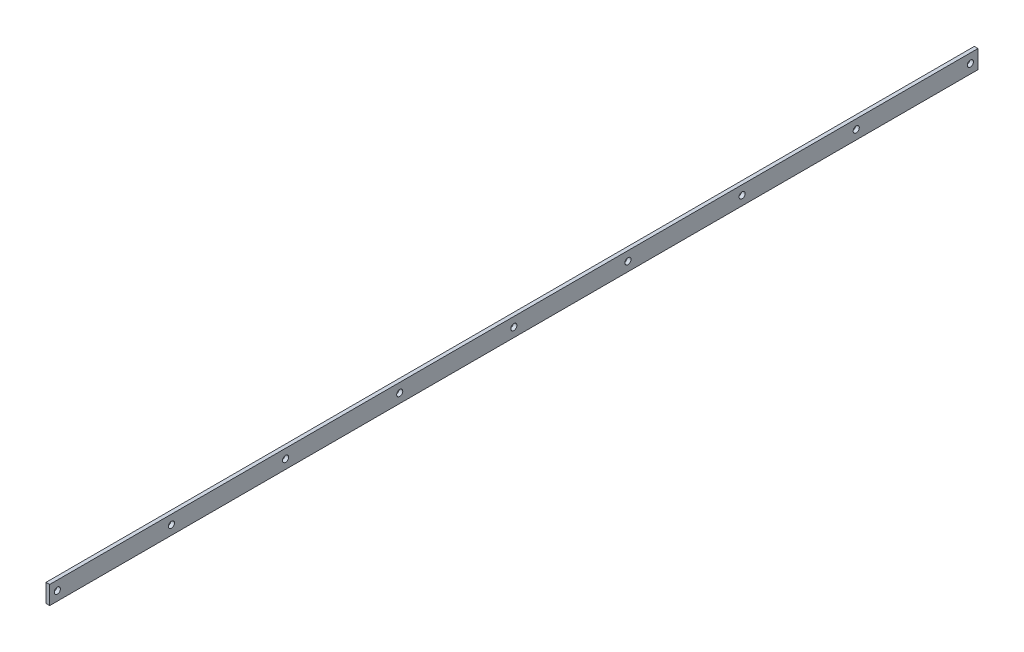
ISO-10303-21;
HEADER;
FILE_DESCRIPTION(('STEP AP214'),'2;1');
FILE_NAME('part.step','',(''),(''),'','','');
FILE_SCHEMA(('AUTOMOTIVE_DESIGN { 1 0 10303 214 1 1 1 1 }'));
ENDSEC;
DATA;
#1=APPLICATION_CONTEXT('core data for automotive mechanical design processes');
#2=APPLICATION_PROTOCOL_DEFINITION('international standard','automotive_design',2000,#1);
#3=PRODUCT_CONTEXT('',#1,'mechanical');
#4=PRODUCT('Part','Part','',(#3));
#5=PRODUCT_RELATED_PRODUCT_CATEGORY('part','',(#4));
#6=PRODUCT_DEFINITION_FORMATION('','',#4);
#7=PRODUCT_DEFINITION_CONTEXT('part definition',#1,'design');
#8=PRODUCT_DEFINITION('design','',#6,#7);
#9=PRODUCT_DEFINITION_SHAPE('','',#8);
#10=(LENGTH_UNIT() NAMED_UNIT(*) SI_UNIT(.MILLI.,.METRE.));
#11=(NAMED_UNIT(*) PLANE_ANGLE_UNIT() SI_UNIT($,.RADIAN.));
#12=(NAMED_UNIT(*) SI_UNIT($,.STERADIAN.) SOLID_ANGLE_UNIT());
#13=UNCERTAINTY_MEASURE_WITH_UNIT(LENGTH_MEASURE(1.E-05),#10,'distance_accuracy_value','');
#14=(GEOMETRIC_REPRESENTATION_CONTEXT(3) GLOBAL_UNCERTAINTY_ASSIGNED_CONTEXT((#13)) GLOBAL_UNIT_ASSIGNED_CONTEXT((#10,
#11,#12)) REPRESENTATION_CONTEXT('',''));
#15=CARTESIAN_POINT('',(0.,0.,0.));
#16=DIRECTION('',(0.,0.,1.));
#17=DIRECTION('',(1.,0.,0.));
#18=AXIS2_PLACEMENT_3D('',#15,#16,#17);
#19=CARTESIAN_POINT('',(0.,0.,-1492.));
#20=DIRECTION('',(1.,0.,0.));
#21=DIRECTION('',(0.,0.,-1.));
#22=AXIS2_PLACEMENT_3D('',#19,#20,#21);
#23=CYLINDRICAL_SURFACE('',#22,10.0000000000001);
#24=CARTESIAN_POINT('',(0.,0.,-1492.));
#25=DIRECTION('',(1.,0.,0.));
#26=DIRECTION('',(0.,0.,-1.));
#27=AXIS2_PLACEMENT_3D('',#24,#25,#26);
#28=CIRCLE('',#27,10.0000000000001);
#29=CARTESIAN_POINT('',(0.,0.,-1502.));
#30=VERTEX_POINT('',#29);
#31=EDGE_CURVE('E41',#30,#30,#28,.T.);
#32=ORIENTED_EDGE('',*,*,#31,.F.);
#33=EDGE_LOOP('',(#32));
#34=FACE_BOUND('',#33,.T.);
#35=CARTESIAN_POINT('',(12.,0.,-1492.));
#36=DIRECTION('',(1.,0.,0.));
#37=DIRECTION('',(0.,0.,-1.));
#38=AXIS2_PLACEMENT_3D('',#35,#36,#37);
#39=CIRCLE('',#38,10.0000000000001);
#40=CARTESIAN_POINT('',(12.,0.,-1502.));
#41=VERTEX_POINT('',#40);
#42=EDGE_CURVE('E11',#41,#41,#39,.T.);
#43=ORIENTED_EDGE('',*,*,#42,.T.);
#44=EDGE_LOOP('',(#43));
#45=FACE_BOUND('',#44,.T.);
#46=ADVANCED_FACE('F33',(#34,#45),#23,.F.);
#47=CARTESIAN_POINT('',(0.,0.,-1119.));
#48=DIRECTION('',(1.,0.,0.));
#49=DIRECTION('',(0.,0.,-1.));
#50=AXIS2_PLACEMENT_3D('',#47,#48,#49);
#51=CYLINDRICAL_SURFACE('',#50,10.0000000000001);
#52=CARTESIAN_POINT('',(0.,0.,-1119.));
#53=DIRECTION('',(1.,0.,0.));
#54=DIRECTION('',(0.,0.,-1.));
#55=AXIS2_PLACEMENT_3D('',#52,#53,#54);
#56=CIRCLE('',#55,10.0000000000001);
#57=CARTESIAN_POINT('',(0.,0.,-1129.));
#58=VERTEX_POINT('',#57);
#59=EDGE_CURVE('E141',#58,#58,#56,.T.);
#60=ORIENTED_EDGE('',*,*,#59,.F.);
#61=EDGE_LOOP('',(#60));
#62=FACE_BOUND('',#61,.T.);
#63=CARTESIAN_POINT('',(12.,0.,-1119.));
#64=DIRECTION('',(1.,0.,0.));
#65=DIRECTION('',(0.,0.,-1.));
#66=AXIS2_PLACEMENT_3D('',#63,#64,#65);
#67=CIRCLE('',#66,10.0000000000001);
#68=CARTESIAN_POINT('',(12.,0.,-1129.));
#69=VERTEX_POINT('',#68);
#70=EDGE_CURVE('E144',#69,#69,#67,.T.);
#71=ORIENTED_EDGE('',*,*,#70,.T.);
#72=EDGE_LOOP('',(#71));
#73=FACE_BOUND('',#72,.T.);
#74=ADVANCED_FACE('F153',(#62,#73),#51,.F.);
#75=CARTESIAN_POINT('',(0.,0.,-745.999999999997));
#76=DIRECTION('',(1.,0.,0.));
#77=DIRECTION('',(0.,0.,-1.));
#78=AXIS2_PLACEMENT_3D('',#75,#76,#77);
#79=CYLINDRICAL_SURFACE('',#78,10.0000000000001);
#80=CARTESIAN_POINT('',(0.,0.,-745.999999999997));
#81=DIRECTION('',(1.,0.,0.));
#82=DIRECTION('',(0.,0.,-1.));
#83=AXIS2_PLACEMENT_3D('',#80,#81,#82);
#84=CIRCLE('',#83,10.0000000000001);
#85=CARTESIAN_POINT('',(0.,0.,-755.999999999997));
#86=VERTEX_POINT('',#85);
#87=EDGE_CURVE('E135',#86,#86,#84,.T.);
#88=ORIENTED_EDGE('',*,*,#87,.F.);
#89=EDGE_LOOP('',(#88));
#90=FACE_BOUND('',#89,.T.);
#91=CARTESIAN_POINT('',(12.,0.,-745.999999999997));
#92=DIRECTION('',(1.,0.,0.));
#93=DIRECTION('',(0.,0.,-1.));
#94=AXIS2_PLACEMENT_3D('',#91,#92,#93);
#95=CIRCLE('',#94,10.0000000000001);
#96=CARTESIAN_POINT('',(12.,0.,-755.999999999997));
#97=VERTEX_POINT('',#96);
#98=EDGE_CURVE('E138',#97,#97,#95,.T.);
#99=ORIENTED_EDGE('',*,*,#98,.T.);
#100=EDGE_LOOP('',(#99));
#101=FACE_BOUND('',#100,.T.);
#102=ADVANCED_FACE('F196',(#90,#101),#79,.F.);
#103=CARTESIAN_POINT('',(0.,0.,-372.999999999997));
#104=DIRECTION('',(1.,0.,0.));
#105=DIRECTION('',(0.,0.,-1.));
#106=AXIS2_PLACEMENT_3D('',#103,#104,#105);
#107=CYLINDRICAL_SURFACE('',#106,10.0000000000001);
#108=CARTESIAN_POINT('',(0.,0.,-372.999999999997));
#109=DIRECTION('',(1.,0.,0.));
#110=DIRECTION('',(0.,0.,-1.));
#111=AXIS2_PLACEMENT_3D('',#108,#109,#110);
#112=CIRCLE('',#111,10.0000000000001);
#113=CARTESIAN_POINT('',(0.,0.,-382.999999999997));
#114=VERTEX_POINT('',#113);
#115=EDGE_CURVE('E129',#114,#114,#112,.T.);
#116=ORIENTED_EDGE('',*,*,#115,.F.);
#117=EDGE_LOOP('',(#116));
#118=FACE_BOUND('',#117,.T.);
#119=CARTESIAN_POINT('',(12.,0.,-372.999999999997));
#120=DIRECTION('',(1.,0.,0.));
#121=DIRECTION('',(0.,0.,-1.));
#122=AXIS2_PLACEMENT_3D('',#119,#120,#121);
#123=CIRCLE('',#122,10.0000000000001);
#124=CARTESIAN_POINT('',(12.,0.,-382.999999999997));
#125=VERTEX_POINT('',#124);
#126=EDGE_CURVE('E132',#125,#125,#123,.T.);
#127=ORIENTED_EDGE('',*,*,#126,.T.);
#128=EDGE_LOOP('',(#127));
#129=FACE_BOUND('',#128,.T.);
#130=ADVANCED_FACE('F192',(#118,#129),#107,.F.);
#131=CARTESIAN_POINT('',(0.,0.,3.10862446895044E-12));
#132=DIRECTION('',(1.,0.,0.));
#133=DIRECTION('',(0.,0.,-1.));
#134=AXIS2_PLACEMENT_3D('',#131,#132,#133);
#135=CYLINDRICAL_SURFACE('',#134,10.0000000000001);
#136=CARTESIAN_POINT('',(0.,0.,3.10862446895044E-12));
#137=DIRECTION('',(1.,0.,0.));
#138=DIRECTION('',(0.,0.,-1.));
#139=AXIS2_PLACEMENT_3D('',#136,#137,#138);
#140=CIRCLE('',#139,10.0000000000001);
#141=CARTESIAN_POINT('',(0.,0.,-9.99999999999698));
#142=VERTEX_POINT('',#141);
#143=EDGE_CURVE('E123',#142,#142,#140,.T.);
#144=ORIENTED_EDGE('',*,*,#143,.F.);
#145=EDGE_LOOP('',(#144));
#146=FACE_BOUND('',#145,.T.);
#147=CARTESIAN_POINT('',(12.,0.,3.10862446895044E-12));
#148=DIRECTION('',(1.,0.,0.));
#149=DIRECTION('',(0.,0.,-1.));
#150=AXIS2_PLACEMENT_3D('',#147,#148,#149);
#151=CIRCLE('',#150,10.0000000000001);
#152=CARTESIAN_POINT('',(12.,0.,-9.99999999999698));
#153=VERTEX_POINT('',#152);
#154=EDGE_CURVE('E126',#153,#153,#151,.T.);
#155=ORIENTED_EDGE('',*,*,#154,.T.);
#156=EDGE_LOOP('',(#155));
#157=FACE_BOUND('',#156,.T.);
#158=ADVANCED_FACE('F188',(#146,#157),#135,.F.);
#159=CARTESIAN_POINT('',(0.,0.,373.000000000003));
#160=DIRECTION('',(1.,0.,0.));
#161=DIRECTION('',(0.,0.,-1.));
#162=AXIS2_PLACEMENT_3D('',#159,#160,#161);
#163=CYLINDRICAL_SURFACE('',#162,10.0000000000001);
#164=CARTESIAN_POINT('',(0.,0.,373.000000000003));
#165=DIRECTION('',(1.,0.,0.));
#166=DIRECTION('',(0.,0.,-1.));
#167=AXIS2_PLACEMENT_3D('',#164,#165,#166);
#168=CIRCLE('',#167,10.0000000000001);
#169=CARTESIAN_POINT('',(0.,0.,363.000000000003));
#170=VERTEX_POINT('',#169);
#171=EDGE_CURVE('E117',#170,#170,#168,.T.);
#172=ORIENTED_EDGE('',*,*,#171,.F.);
#173=EDGE_LOOP('',(#172));
#174=FACE_BOUND('',#173,.T.);
#175=CARTESIAN_POINT('',(12.,0.,373.000000000003));
#176=DIRECTION('',(1.,0.,0.));
#177=DIRECTION('',(0.,0.,-1.));
#178=AXIS2_PLACEMENT_3D('',#175,#176,#177);
#179=CIRCLE('',#178,10.0000000000001);
#180=CARTESIAN_POINT('',(12.,0.,363.000000000003));
#181=VERTEX_POINT('',#180);
#182=EDGE_CURVE('E120',#181,#181,#179,.T.);
#183=ORIENTED_EDGE('',*,*,#182,.T.);
#184=EDGE_LOOP('',(#183));
#185=FACE_BOUND('',#184,.T.);
#186=ADVANCED_FACE('F184',(#174,#185),#163,.F.);
#187=CARTESIAN_POINT('',(0.,0.,746.000000000003));
#188=DIRECTION('',(1.,0.,0.));
#189=DIRECTION('',(0.,0.,-1.));
#190=AXIS2_PLACEMENT_3D('',#187,#188,#189);
#191=CYLINDRICAL_SURFACE('',#190,10.0000000000001);
#192=CARTESIAN_POINT('',(0.,0.,746.000000000003));
#193=DIRECTION('',(1.,0.,0.));
#194=DIRECTION('',(0.,0.,-1.));
#195=AXIS2_PLACEMENT_3D('',#192,#193,#194);
#196=CIRCLE('',#195,10.0000000000001);
#197=CARTESIAN_POINT('',(0.,0.,736.000000000003));
#198=VERTEX_POINT('',#197);
#199=EDGE_CURVE('E111',#198,#198,#196,.T.);
#200=ORIENTED_EDGE('',*,*,#199,.F.);
#201=EDGE_LOOP('',(#200));
#202=FACE_BOUND('',#201,.T.);
#203=CARTESIAN_POINT('',(12.,0.,746.000000000003));
#204=DIRECTION('',(1.,0.,0.));
#205=DIRECTION('',(0.,0.,-1.));
#206=AXIS2_PLACEMENT_3D('',#203,#204,#205);
#207=CIRCLE('',#206,10.0000000000001);
#208=CARTESIAN_POINT('',(12.,0.,736.000000000003));
#209=VERTEX_POINT('',#208);
#210=EDGE_CURVE('E114',#209,#209,#207,.T.);
#211=ORIENTED_EDGE('',*,*,#210,.T.);
#212=EDGE_LOOP('',(#211));
#213=FACE_BOUND('',#212,.T.);
#214=ADVANCED_FACE('F180',(#202,#213),#191,.F.);
#215=CARTESIAN_POINT('',(12.,-30.,-1517.));
#216=DIRECTION('',(0.,0.,1.));
#217=DIRECTION('',(1.,0.,0.));
#218=AXIS2_PLACEMENT_3D('',#215,#216,#217);
#219=PLANE('',#218);
#220=DIRECTION('',(0.,1.,0.));
#221=VECTOR('',#220,1.);
#222=CARTESIAN_POINT('',(0.,-30.,-1517.));
#223=LINE('',#222,#221);
#224=CARTESIAN_POINT('',(0.,-30.,-1517.));
#225=VERTEX_POINT('',#224);
#226=CARTESIAN_POINT('',(0.,30.,-1517.));
#227=VERTEX_POINT('',#226);
#228=EDGE_CURVE('E101',#225,#227,#223,.T.);
#229=ORIENTED_EDGE('',*,*,#228,.T.);
#230=DIRECTION('',(-1.,0.,0.));
#231=VECTOR('',#230,1.);
#232=CARTESIAN_POINT('',(12.,30.,-1517.));
#233=LINE('',#232,#231);
#234=CARTESIAN_POINT('',(12.,30.,-1517.));
#235=VERTEX_POINT('',#234);
#236=EDGE_CURVE('E92',#235,#227,#233,.T.);
#237=ORIENTED_EDGE('',*,*,#236,.F.);
#238=DIRECTION('',(0.,1.,0.));
#239=VECTOR('',#238,1.);
#240=CARTESIAN_POINT('',(12.,-30.,-1517.));
#241=LINE('',#240,#239);
#242=CARTESIAN_POINT('',(12.,-30.,-1517.));
#243=VERTEX_POINT('',#242);
#244=EDGE_CURVE('E86',#243,#235,#241,.T.);
#245=ORIENTED_EDGE('',*,*,#244,.F.);
#246=DIRECTION('',(-1.,0.,0.));
#247=VECTOR('',#246,1.);
#248=CARTESIAN_POINT('',(12.,-30.,-1517.));
#249=LINE('',#248,#247);
#250=EDGE_CURVE('E97',#243,#225,#249,.T.);
#251=ORIENTED_EDGE('',*,*,#250,.T.);
#252=EDGE_LOOP('',(#229,#237,#245,#251));
#253=FACE_BOUND('',#252,.T.);
#254=ADVANCED_FACE('F177',(#253),#219,.F.);
#255=CARTESIAN_POINT('',(12.,30.,1517.));
#256=DIRECTION('',(0.,-1.,0.));
#257=DIRECTION('',(0.,0.,-1.));
#258=AXIS2_PLACEMENT_3D('',#255,#256,#257);
#259=PLANE('',#258);
#260=DIRECTION('',(0.,0.,1.));
#261=VECTOR('',#260,1.);
#262=CARTESIAN_POINT('',(0.,30.,1517.));
#263=LINE('',#262,#261);
#264=CARTESIAN_POINT('',(0.,30.,1517.));
#265=VERTEX_POINT('',#264);
#266=EDGE_CURVE('E91',#227,#265,#263,.T.);
#267=ORIENTED_EDGE('',*,*,#266,.T.);
#268=DIRECTION('',(-1.,0.,0.));
#269=VECTOR('',#268,1.);
#270=CARTESIAN_POINT('',(12.,30.,1517.));
#271=LINE('',#270,#269);
#272=CARTESIAN_POINT('',(12.,30.,1517.));
#273=VERTEX_POINT('',#272);
#274=EDGE_CURVE('E89',#273,#265,#271,.T.);
#275=ORIENTED_EDGE('',*,*,#274,.F.);
#276=DIRECTION('',(0.,0.,1.));
#277=VECTOR('',#276,1.);
#278=CARTESIAN_POINT('',(12.,30.,1517.));
#279=LINE('',#278,#277);
#280=EDGE_CURVE('E80',#235,#273,#279,.T.);
#281=ORIENTED_EDGE('',*,*,#280,.F.);
#282=ORIENTED_EDGE('',*,*,#236,.T.);
#283=EDGE_LOOP('',(#267,#275,#281,#282));
#284=FACE_BOUND('',#283,.T.);
#285=ADVANCED_FACE('F90',(#284),#259,.F.);
#286=CARTESIAN_POINT('',(12.,-30.,1517.));
#287=DIRECTION('',(0.,0.,-1.));
#288=DIRECTION('',(-1.,0.,0.));
#289=AXIS2_PLACEMENT_3D('',#286,#287,#288);
#290=PLANE('',#289);
#291=DIRECTION('',(0.,-1.,0.));
#292=VECTOR('',#291,1.);
#293=CARTESIAN_POINT('',(0.,-30.,1517.));
#294=LINE('',#293,#292);
#295=CARTESIAN_POINT('',(0.,-30.,1517.));
#296=VERTEX_POINT('',#295);
#297=EDGE_CURVE('E66',#265,#296,#294,.T.);
#298=ORIENTED_EDGE('',*,*,#297,.T.);
#299=DIRECTION('',(-1.,0.,0.));
#300=VECTOR('',#299,1.);
#301=CARTESIAN_POINT('',(12.,-30.,1517.));
#302=LINE('',#301,#300);
#303=CARTESIAN_POINT('',(12.,-30.,1517.));
#304=VERTEX_POINT('',#303);
#305=EDGE_CURVE('E93',#304,#296,#302,.T.);
#306=ORIENTED_EDGE('',*,*,#305,.F.);
#307=DIRECTION('',(0.,-1.,0.));
#308=VECTOR('',#307,1.);
#309=CARTESIAN_POINT('',(12.,-30.,1517.));
#310=LINE('',#309,#308);
#311=EDGE_CURVE('E84',#273,#304,#310,.T.);
#312=ORIENTED_EDGE('',*,*,#311,.F.);
#313=ORIENTED_EDGE('',*,*,#274,.T.);
#314=EDGE_LOOP('',(#298,#306,#312,#313));
#315=FACE_BOUND('',#314,.T.);
#316=ADVANCED_FACE('F95',(#315),#290,.F.);
#317=CARTESIAN_POINT('',(12.,-30.,1517.));
#318=DIRECTION('',(0.,1.,0.));
#319=DIRECTION('',(0.,0.,1.));
#320=AXIS2_PLACEMENT_3D('',#317,#318,#319);
#321=PLANE('',#320);
#322=DIRECTION('',(0.,0.,-1.));
#323=VECTOR('',#322,1.);
#324=CARTESIAN_POINT('',(0.,-30.,1517.));
#325=LINE('',#324,#323);
#326=EDGE_CURVE('E72',#296,#225,#325,.T.);
#327=ORIENTED_EDGE('',*,*,#326,.T.);
#328=ORIENTED_EDGE('',*,*,#250,.F.);
#329=DIRECTION('',(0.,0.,-1.));
#330=VECTOR('',#329,1.);
#331=CARTESIAN_POINT('',(12.,-30.,1517.));
#332=LINE('',#331,#330);
#333=EDGE_CURVE('E49',#304,#243,#332,.T.);
#334=ORIENTED_EDGE('',*,*,#333,.F.);
#335=ORIENTED_EDGE('',*,*,#305,.T.);
#336=EDGE_LOOP('',(#327,#328,#334,#335));
#337=FACE_BOUND('',#336,.T.);
#338=ADVANCED_FACE('F157',(#337),#321,.F.);
#339=CARTESIAN_POINT('',(12.,0.,0.));
#340=DIRECTION('',(-1.,0.,0.));
#341=DIRECTION('',(0.,0.,1.));
#342=AXIS2_PLACEMENT_3D('',#339,#340,#341);
#343=PLANE('',#342);
#344=CARTESIAN_POINT('',(12.,0.,1119.));
#345=DIRECTION('',(1.,0.,0.));
#346=DIRECTION('',(0.,0.,-1.));
#347=AXIS2_PLACEMENT_3D('',#344,#345,#346);
#348=CIRCLE('',#347,10.0000000000001);
#349=CARTESIAN_POINT('',(12.,0.,1109.));
#350=VERTEX_POINT('',#349);
#351=EDGE_CURVE('E299',#350,#350,#348,.T.);
#352=ORIENTED_EDGE('',*,*,#351,.F.);
#353=EDGE_LOOP('',(#352));
#354=FACE_BOUND('',#353,.T.);
#355=CARTESIAN_POINT('',(12.,0.,1492.));
#356=DIRECTION('',(1.,0.,0.));
#357=DIRECTION('',(0.,0.,-1.));
#358=AXIS2_PLACEMENT_3D('',#355,#356,#357);
#359=CIRCLE('',#358,10.0000000000001);
#360=CARTESIAN_POINT('',(12.,0.,1482.));
#361=VERTEX_POINT('',#360);
#362=EDGE_CURVE('E300',#361,#361,#359,.T.);
#363=ORIENTED_EDGE('',*,*,#362,.F.);
#364=EDGE_LOOP('',(#363));
#365=FACE_BOUND('',#364,.T.);
#366=ORIENTED_EDGE('',*,*,#244,.T.);
#367=ORIENTED_EDGE('',*,*,#280,.T.);
#368=ORIENTED_EDGE('',*,*,#311,.T.);
#369=ORIENTED_EDGE('',*,*,#333,.T.);
#370=EDGE_LOOP('',(#366,#367,#368,#369));
#371=FACE_BOUND('',#370,.T.);
#372=ORIENTED_EDGE('',*,*,#210,.F.);
#373=EDGE_LOOP('',(#372));
#374=FACE_BOUND('',#373,.T.);
#375=ORIENTED_EDGE('',*,*,#182,.F.);
#376=EDGE_LOOP('',(#375));
#377=FACE_BOUND('',#376,.T.);
#378=ORIENTED_EDGE('',*,*,#154,.F.);
#379=EDGE_LOOP('',(#378));
#380=FACE_BOUND('',#379,.T.);
#381=ORIENTED_EDGE('',*,*,#126,.F.);
#382=EDGE_LOOP('',(#381));
#383=FACE_BOUND('',#382,.T.);
#384=ORIENTED_EDGE('',*,*,#98,.F.);
#385=EDGE_LOOP('',(#384));
#386=FACE_BOUND('',#385,.T.);
#387=ORIENTED_EDGE('',*,*,#70,.F.);
#388=EDGE_LOOP('',(#387));
#389=FACE_BOUND('',#388,.T.);
#390=ORIENTED_EDGE('',*,*,#42,.F.);
#391=EDGE_LOOP('',(#390));
#392=FACE_BOUND('',#391,.T.);
#393=ADVANCED_FACE('F81',(#354,#365,#371,#374,#377,#380,#383,#386,#389,#392),#343,.F.);
#394=CARTESIAN_POINT('',(0.,0.,0.));
#395=DIRECTION('',(-1.,0.,0.));
#396=DIRECTION('',(0.,0.,1.));
#397=AXIS2_PLACEMENT_3D('',#394,#395,#396);
#398=PLANE('',#397);
#399=CARTESIAN_POINT('',(0.,0.,1119.));
#400=DIRECTION('',(1.,0.,0.));
#401=DIRECTION('',(0.,0.,-1.));
#402=AXIS2_PLACEMENT_3D('',#399,#400,#401);
#403=CIRCLE('',#402,10.0000000000001);
#404=CARTESIAN_POINT('',(0.,0.,1109.));
#405=VERTEX_POINT('',#404);
#406=EDGE_CURVE('E297',#405,#405,#403,.T.);
#407=ORIENTED_EDGE('',*,*,#406,.T.);
#408=EDGE_LOOP('',(#407));
#409=FACE_BOUND('',#408,.T.);
#410=CARTESIAN_POINT('',(0.,0.,1492.));
#411=DIRECTION('',(1.,0.,0.));
#412=DIRECTION('',(0.,0.,-1.));
#413=AXIS2_PLACEMENT_3D('',#410,#411,#412);
#414=CIRCLE('',#413,10.0000000000001);
#415=CARTESIAN_POINT('',(0.,0.,1482.));
#416=VERTEX_POINT('',#415);
#417=EDGE_CURVE('E104',#416,#416,#414,.T.);
#418=ORIENTED_EDGE('',*,*,#417,.T.);
#419=EDGE_LOOP('',(#418));
#420=FACE_BOUND('',#419,.T.);
#421=ORIENTED_EDGE('',*,*,#228,.F.);
#422=ORIENTED_EDGE('',*,*,#326,.F.);
#423=ORIENTED_EDGE('',*,*,#297,.F.);
#424=ORIENTED_EDGE('',*,*,#266,.F.);
#425=EDGE_LOOP('',(#421,#422,#423,#424));
#426=FACE_BOUND('',#425,.T.);
#427=ORIENTED_EDGE('',*,*,#199,.T.);
#428=EDGE_LOOP('',(#427));
#429=FACE_BOUND('',#428,.T.);
#430=ORIENTED_EDGE('',*,*,#171,.T.);
#431=EDGE_LOOP('',(#430));
#432=FACE_BOUND('',#431,.T.);
#433=ORIENTED_EDGE('',*,*,#143,.T.);
#434=EDGE_LOOP('',(#433));
#435=FACE_BOUND('',#434,.T.);
#436=ORIENTED_EDGE('',*,*,#115,.T.);
#437=EDGE_LOOP('',(#436));
#438=FACE_BOUND('',#437,.T.);
#439=ORIENTED_EDGE('',*,*,#87,.T.);
#440=EDGE_LOOP('',(#439));
#441=FACE_BOUND('',#440,.T.);
#442=ORIENTED_EDGE('',*,*,#59,.T.);
#443=EDGE_LOOP('',(#442));
#444=FACE_BOUND('',#443,.T.);
#445=ORIENTED_EDGE('',*,*,#31,.T.);
#446=EDGE_LOOP('',(#445));
#447=FACE_BOUND('',#446,.T.);
#448=ADVANCED_FACE('F149',(#409,#420,#426,#429,#432,#435,#438,#441,#444,#447),#398,.T.);
#449=CARTESIAN_POINT('',(0.,0.,1492.));
#450=DIRECTION('',(1.,0.,0.));
#451=DIRECTION('',(0.,0.,-1.));
#452=AXIS2_PLACEMENT_3D('',#449,#450,#451);
#453=CYLINDRICAL_SURFACE('',#452,10.0000000000001);
#454=ORIENTED_EDGE('',*,*,#417,.F.);
#455=EDGE_LOOP('',(#454));
#456=FACE_BOUND('',#455,.T.);
#457=ORIENTED_EDGE('',*,*,#362,.T.);
#458=EDGE_LOOP('',(#457));
#459=FACE_BOUND('',#458,.T.);
#460=ADVANCED_FACE('F164',(#456,#459),#453,.F.);
#461=CARTESIAN_POINT('',(0.,0.,1119.));
#462=DIRECTION('',(1.,0.,0.));
#463=DIRECTION('',(0.,0.,-1.));
#464=AXIS2_PLACEMENT_3D('',#461,#462,#463);
#465=CYLINDRICAL_SURFACE('',#464,10.0000000000001);
#466=ORIENTED_EDGE('',*,*,#406,.F.);
#467=EDGE_LOOP('',(#466));
#468=FACE_BOUND('',#467,.T.);
#469=ORIENTED_EDGE('',*,*,#351,.T.);
#470=EDGE_LOOP('',(#469));
#471=FACE_BOUND('',#470,.T.);
#472=ADVANCED_FACE('F256',(#468,#471),#465,.F.);
#473=CLOSED_SHELL('',(#46,#74,#102,#130,#158,#186,#214,#254,#285,#316,#338,#393,#448,#460,#472));
#474=MANIFOLD_SOLID_BREP('B2',#473);
#475=ADVANCED_BREP_SHAPE_REPRESENTATION('',(#18,#474),#14);
#476=SHAPE_DEFINITION_REPRESENTATION(#9,#475);
ENDSEC;
END-ISO-10303-21;
